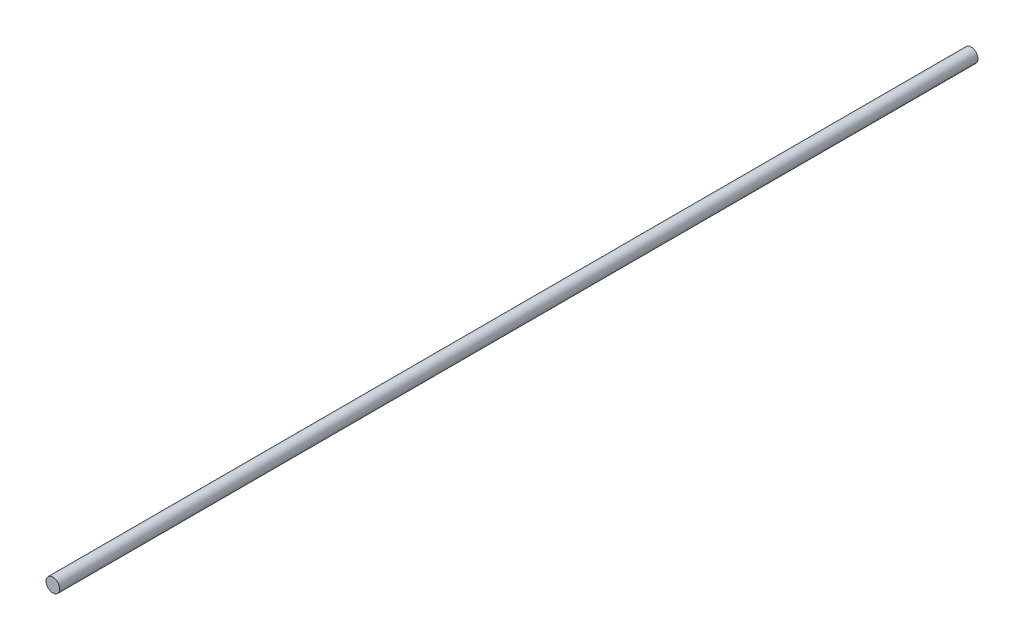
ISO-10303-21;
HEADER;
FILE_DESCRIPTION(('STEP AP214'),'2;1');
FILE_NAME('part.step','',(''),(''),'','','');
FILE_SCHEMA(('AUTOMOTIVE_DESIGN { 1 0 10303 214 1 1 1 1 }'));
ENDSEC;
DATA;
#1=APPLICATION_CONTEXT('core data for automotive mechanical design processes');
#2=APPLICATION_PROTOCOL_DEFINITION('international standard','automotive_design',2000,#1);
#3=PRODUCT_CONTEXT('',#1,'mechanical');
#4=PRODUCT('Part','Part','',(#3));
#5=PRODUCT_RELATED_PRODUCT_CATEGORY('part','',(#4));
#6=PRODUCT_DEFINITION_FORMATION('','',#4);
#7=PRODUCT_DEFINITION_CONTEXT('part definition',#1,'design');
#8=PRODUCT_DEFINITION('design','',#6,#7);
#9=PRODUCT_DEFINITION_SHAPE('','',#8);
#10=(LENGTH_UNIT() NAMED_UNIT(*) SI_UNIT(.MILLI.,.METRE.));
#11=(NAMED_UNIT(*) PLANE_ANGLE_UNIT() SI_UNIT($,.RADIAN.));
#12=(NAMED_UNIT(*) SI_UNIT($,.STERADIAN.) SOLID_ANGLE_UNIT());
#13=UNCERTAINTY_MEASURE_WITH_UNIT(LENGTH_MEASURE(1.E-05),#10,'distance_accuracy_value','');
#14=(GEOMETRIC_REPRESENTATION_CONTEXT(3) GLOBAL_UNCERTAINTY_ASSIGNED_CONTEXT((#13)) GLOBAL_UNIT_ASSIGNED_CONTEXT((#10,
#11,#12)) REPRESENTATION_CONTEXT('',''));
#15=CARTESIAN_POINT('',(0.,0.,0.));
#16=DIRECTION('',(0.,0.,1.));
#17=DIRECTION('',(1.,0.,0.));
#18=AXIS2_PLACEMENT_3D('',#15,#16,#17);
#19=CARTESIAN_POINT('',(350.,1060.,-640.));
#20=DIRECTION('',(0.,0.,1.));
#21=DIRECTION('',(1.,0.,0.));
#22=AXIS2_PLACEMENT_3D('',#19,#20,#21);
#23=CYLINDRICAL_SURFACE('',#22,3.);
#24=CARTESIAN_POINT('',(350.,1060.,-640.));
#25=DIRECTION('',(0.,0.,1.));
#26=DIRECTION('',(1.,0.,0.));
#27=AXIS2_PLACEMENT_3D('',#24,#25,#26);
#28=CIRCLE('',#27,3.);
#29=CARTESIAN_POINT('',(353.,1060.,-640.));
#30=VERTEX_POINT('',#29);
#31=EDGE_CURVE('E10',#30,#30,#28,.T.);
#32=ORIENTED_EDGE('',*,*,#31,.T.);
#33=EDGE_LOOP('',(#32));
#34=FACE_BOUND('',#33,.T.);
#35=CARTESIAN_POINT('',(350.,1060.,-240.));
#36=DIRECTION('',(0.,0.,1.));
#37=DIRECTION('',(1.,0.,0.));
#38=AXIS2_PLACEMENT_3D('',#35,#36,#37);
#39=CIRCLE('',#38,3.);
#40=CARTESIAN_POINT('',(353.,1060.,-240.));
#41=VERTEX_POINT('',#40);
#42=EDGE_CURVE('E40',#41,#41,#39,.T.);
#43=ORIENTED_EDGE('',*,*,#42,.F.);
#44=EDGE_LOOP('',(#43));
#45=FACE_BOUND('',#44,.T.);
#46=ADVANCED_FACE('F37',(#34,#45),#23,.T.);
#47=CARTESIAN_POINT('',(350.,1060.,-640.));
#48=DIRECTION('',(0.,0.,1.));
#49=DIRECTION('',(1.,0.,0.));
#50=AXIS2_PLACEMENT_3D('',#47,#48,#49);
#51=PLANE('',#50);
#52=ORIENTED_EDGE('',*,*,#31,.F.);
#53=EDGE_LOOP('',(#52));
#54=FACE_BOUND('',#53,.T.);
#55=ADVANCED_FACE('F52',(#54),#51,.F.);
#56=CARTESIAN_POINT('',(350.,1060.,-240.));
#57=DIRECTION('',(0.,0.,1.));
#58=DIRECTION('',(1.,0.,0.));
#59=AXIS2_PLACEMENT_3D('',#56,#57,#58);
#60=PLANE('',#59);
#61=ORIENTED_EDGE('',*,*,#42,.T.);
#62=EDGE_LOOP('',(#61));
#63=FACE_BOUND('',#62,.T.);
#64=ADVANCED_FACE('F49',(#63),#60,.T.);
#65=CLOSED_SHELL('',(#46,#55,#64));
#66=MANIFOLD_SOLID_BREP('B2',#65);
#67=ADVANCED_BREP_SHAPE_REPRESENTATION('',(#18,#66),#14);
#68=SHAPE_DEFINITION_REPRESENTATION(#9,#67);
ENDSEC;
END-ISO-10303-21;
